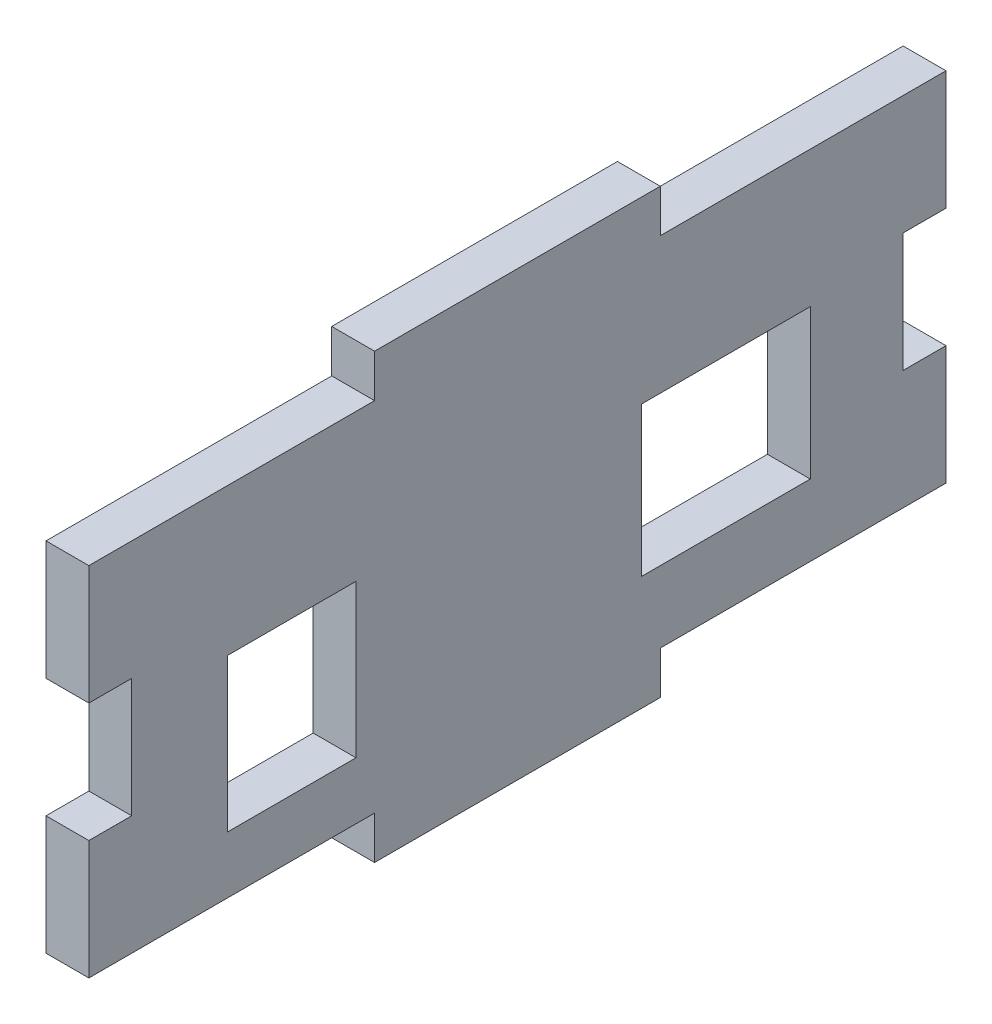
ISO-10303-21;
HEADER;
FILE_DESCRIPTION(('STEP AP214'),'2;1');
FILE_NAME('part.step','',(''),(''),'','','');
FILE_SCHEMA(('AUTOMOTIVE_DESIGN { 1 0 10303 214 1 1 1 1 }'));
ENDSEC;
DATA;
#1=APPLICATION_CONTEXT('core data for automotive mechanical design processes');
#2=APPLICATION_PROTOCOL_DEFINITION('international standard','automotive_design',2000,#1);
#3=PRODUCT_CONTEXT('',#1,'mechanical');
#4=PRODUCT('Part','Part','',(#3));
#5=PRODUCT_RELATED_PRODUCT_CATEGORY('part','',(#4));
#6=PRODUCT_DEFINITION_FORMATION('','',#4);
#7=PRODUCT_DEFINITION_CONTEXT('part definition',#1,'design');
#8=PRODUCT_DEFINITION('design','',#6,#7);
#9=PRODUCT_DEFINITION_SHAPE('','',#8);
#10=(LENGTH_UNIT() NAMED_UNIT(*) SI_UNIT(.MILLI.,.METRE.));
#11=(NAMED_UNIT(*) PLANE_ANGLE_UNIT() SI_UNIT($,.RADIAN.));
#12=(NAMED_UNIT(*) SI_UNIT($,.STERADIAN.) SOLID_ANGLE_UNIT());
#13=UNCERTAINTY_MEASURE_WITH_UNIT(LENGTH_MEASURE(1.E-05),#10,'distance_accuracy_value','');
#14=(GEOMETRIC_REPRESENTATION_CONTEXT(3) GLOBAL_UNCERTAINTY_ASSIGNED_CONTEXT((#13)) GLOBAL_UNIT_ASSIGNED_CONTEXT((#10,
#11,#12)) REPRESENTATION_CONTEXT('',''));
#15=CARTESIAN_POINT('',(0.,0.,0.));
#16=DIRECTION('',(0.,0.,1.));
#17=DIRECTION('',(1.,0.,0.));
#18=AXIS2_PLACEMENT_3D('',#15,#16,#17);
#19=CARTESIAN_POINT('',(3.,0.,0.));
#20=DIRECTION('',(-1.,0.,0.));
#21=DIRECTION('',(0.,0.,1.));
#22=AXIS2_PLACEMENT_3D('',#19,#20,#21);
#23=PLANE('',#22);
#24=DIRECTION('',(0.,1.,0.));
#25=VECTOR('',#24,1.);
#26=CARTESIAN_POINT('',(3.,15.45,-50.5));
#27=LINE('',#26,#25);
#28=CARTESIAN_POINT('',(3.,5.,-50.5));
#29=VERTEX_POINT('',#28);
#30=CARTESIAN_POINT('',(3.,15.45,-50.5));
#31=VERTEX_POINT('',#30);
#32=EDGE_CURVE('E254',#29,#31,#27,.T.);
#33=ORIENTED_EDGE('',*,*,#32,.F.);
#34=DIRECTION('',(0.,0.,-1.));
#35=VECTOR('',#34,1.);
#36=CARTESIAN_POINT('',(3.,5.,-50.5));
#37=LINE('',#36,#35);
#38=CARTESIAN_POINT('',(3.,5.,-38.7));
#39=VERTEX_POINT('',#38);
#40=EDGE_CURVE('E262',#39,#29,#37,.T.);
#41=ORIENTED_EDGE('',*,*,#40,.F.);
#42=DIRECTION('',(0.,-1.,0.));
#43=VECTOR('',#42,1.);
#44=CARTESIAN_POINT('',(3.,15.45,-38.7));
#45=LINE('',#44,#43);
#46=CARTESIAN_POINT('',(3.,15.45,-38.7));
#47=VERTEX_POINT('',#46);
#48=EDGE_CURVE('E259',#47,#39,#45,.T.);
#49=ORIENTED_EDGE('',*,*,#48,.F.);
#50=DIRECTION('',(0.,0.,1.));
#51=VECTOR('',#50,1.);
#52=CARTESIAN_POINT('',(3.,15.45,-50.5));
#53=LINE('',#52,#51);
#54=EDGE_CURVE('E256',#31,#47,#53,.T.);
#55=ORIENTED_EDGE('',*,*,#54,.F.);
#56=EDGE_LOOP('',(#33,#41,#49,#55));
#57=FACE_BOUND('',#56,.T.);
#58=DIRECTION('',(0.,-1.,0.));
#59=VECTOR('',#58,1.);
#60=CARTESIAN_POINT('',(3.,0.,0.));
#61=LINE('',#60,#59);
#62=CARTESIAN_POINT('',(3.,8.33333333,0.));
#63=VERTEX_POINT('',#62);
#64=CARTESIAN_POINT('',(3.,0.,0.));
#65=VERTEX_POINT('',#64);
#66=EDGE_CURVE('E285',#63,#65,#61,.T.);
#67=ORIENTED_EDGE('',*,*,#66,.T.);
#68=DIRECTION('',(0.,0.,-1.));
#69=VECTOR('',#68,1.);
#70=CARTESIAN_POINT('',(3.,0.,0.));
#71=LINE('',#70,#69);
#72=CARTESIAN_POINT('',(3.,0.,-20.));
#73=VERTEX_POINT('',#72);
#74=EDGE_CURVE('E288',#65,#73,#71,.T.);
#75=ORIENTED_EDGE('',*,*,#74,.T.);
#76=DIRECTION('',(0.,-1.,0.));
#77=VECTOR('',#76,1.);
#78=CARTESIAN_POINT('',(3.,0.,-20.));
#79=LINE('',#78,#77);
#80=CARTESIAN_POINT('',(3.,-3.,-20.));
#81=VERTEX_POINT('',#80);
#82=EDGE_CURVE('E291',#73,#81,#79,.T.);
#83=ORIENTED_EDGE('',*,*,#82,.T.);
#84=DIRECTION('',(0.,0.,-1.));
#85=VECTOR('',#84,1.);
#86=CARTESIAN_POINT('',(3.,-3.,-20.));
#87=LINE('',#86,#85);
#88=CARTESIAN_POINT('',(3.,-3.,-40.));
#89=VERTEX_POINT('',#88);
#90=EDGE_CURVE('E293',#81,#89,#87,.T.);
#91=ORIENTED_EDGE('',*,*,#90,.T.);
#92=DIRECTION('',(0.,1.,0.));
#93=VECTOR('',#92,1.);
#94=CARTESIAN_POINT('',(3.,0.,-40.));
#95=LINE('',#94,#93);
#96=CARTESIAN_POINT('',(3.,0.,-40.));
#97=VERTEX_POINT('',#96);
#98=EDGE_CURVE('E295',#89,#97,#95,.T.);
#99=ORIENTED_EDGE('',*,*,#98,.T.);
#100=DIRECTION('',(0.,0.,-1.));
#101=VECTOR('',#100,1.);
#102=CARTESIAN_POINT('',(3.,0.,-40.));
#103=LINE('',#102,#101);
#104=CARTESIAN_POINT('',(3.,0.,-60.));
#105=VERTEX_POINT('',#104);
#106=EDGE_CURVE('E297',#97,#105,#103,.T.);
#107=ORIENTED_EDGE('',*,*,#106,.T.);
#108=DIRECTION('',(0.,1.,0.));
#109=VECTOR('',#108,1.);
#110=CARTESIAN_POINT('',(3.,0.,-60.));
#111=LINE('',#110,#109);
#112=CARTESIAN_POINT('',(3.,8.33333333,-60.));
#113=VERTEX_POINT('',#112);
#114=EDGE_CURVE('E299',#105,#113,#111,.T.);
#115=ORIENTED_EDGE('',*,*,#114,.T.);
#116=DIRECTION('',(0.,0.,1.));
#117=VECTOR('',#116,1.);
#118=CARTESIAN_POINT('',(3.,8.33333333,-60.));
#119=LINE('',#118,#117);
#120=CARTESIAN_POINT('',(3.,8.33333333,-57.));
#121=VERTEX_POINT('',#120);
#122=EDGE_CURVE('E301',#113,#121,#119,.T.);
#123=ORIENTED_EDGE('',*,*,#122,.T.);
#124=DIRECTION('',(0.,1.,0.));
#125=VECTOR('',#124,1.);
#126=CARTESIAN_POINT('',(3.,16.66666666,-57.));
#127=LINE('',#126,#125);
#128=CARTESIAN_POINT('',(3.,16.66666666,-57.));
#129=VERTEX_POINT('',#128);
#130=EDGE_CURVE('E303',#121,#129,#127,.T.);
#131=ORIENTED_EDGE('',*,*,#130,.T.);
#132=DIRECTION('',(0.,0.,-1.));
#133=VECTOR('',#132,1.);
#134=CARTESIAN_POINT('',(3.,16.66666666,-60.));
#135=LINE('',#134,#133);
#136=CARTESIAN_POINT('',(3.,16.66666666,-60.));
#137=VERTEX_POINT('',#136);
#138=EDGE_CURVE('E305',#129,#137,#135,.T.);
#139=ORIENTED_EDGE('',*,*,#138,.T.);
#140=DIRECTION('',(0.,1.,0.));
#141=VECTOR('',#140,1.);
#142=CARTESIAN_POINT('',(3.,16.66666666,-60.));
#143=LINE('',#142,#141);
#144=CARTESIAN_POINT('',(3.,25.,-60.));
#145=VERTEX_POINT('',#144);
#146=EDGE_CURVE('E307',#137,#145,#143,.T.);
#147=ORIENTED_EDGE('',*,*,#146,.T.);
#148=DIRECTION('',(0.,0.,1.));
#149=VECTOR('',#148,1.);
#150=CARTESIAN_POINT('',(3.,25.,-40.));
#151=LINE('',#150,#149);
#152=CARTESIAN_POINT('',(3.,25.,-40.));
#153=VERTEX_POINT('',#152);
#154=EDGE_CURVE('E309',#145,#153,#151,.T.);
#155=ORIENTED_EDGE('',*,*,#154,.T.);
#156=DIRECTION('',(0.,1.,0.));
#157=VECTOR('',#156,1.);
#158=CARTESIAN_POINT('',(3.,25.,-40.));
#159=LINE('',#158,#157);
#160=CARTESIAN_POINT('',(3.,28.,-40.));
#161=VERTEX_POINT('',#160);
#162=EDGE_CURVE('E311',#153,#161,#159,.T.);
#163=ORIENTED_EDGE('',*,*,#162,.T.);
#164=DIRECTION('',(0.,0.,1.));
#165=VECTOR('',#164,1.);
#166=CARTESIAN_POINT('',(3.,28.,-20.));
#167=LINE('',#166,#165);
#168=CARTESIAN_POINT('',(3.,28.,-20.));
#169=VERTEX_POINT('',#168);
#170=EDGE_CURVE('E313',#161,#169,#167,.T.);
#171=ORIENTED_EDGE('',*,*,#170,.T.);
#172=DIRECTION('',(0.,-1.,0.));
#173=VECTOR('',#172,1.);
#174=CARTESIAN_POINT('',(3.,25.,-20.));
#175=LINE('',#174,#173);
#176=CARTESIAN_POINT('',(3.,25.,-20.));
#177=VERTEX_POINT('',#176);
#178=EDGE_CURVE('E315',#169,#177,#175,.T.);
#179=ORIENTED_EDGE('',*,*,#178,.T.);
#180=DIRECTION('',(0.,0.,1.));
#181=VECTOR('',#180,1.);
#182=CARTESIAN_POINT('',(3.,25.,0.));
#183=LINE('',#182,#181);
#184=CARTESIAN_POINT('',(3.,25.,0.));
#185=VERTEX_POINT('',#184);
#186=EDGE_CURVE('E317',#177,#185,#183,.T.);
#187=ORIENTED_EDGE('',*,*,#186,.T.);
#188=DIRECTION('',(0.,-1.,0.));
#189=VECTOR('',#188,1.);
#190=CARTESIAN_POINT('',(3.,16.66666666,0.));
#191=LINE('',#190,#189);
#192=CARTESIAN_POINT('',(3.,16.66666666,0.));
#193=VERTEX_POINT('',#192);
#194=EDGE_CURVE('E319',#185,#193,#191,.T.);
#195=ORIENTED_EDGE('',*,*,#194,.T.);
#196=DIRECTION('',(0.,0.,-1.));
#197=VECTOR('',#196,1.);
#198=CARTESIAN_POINT('',(3.,16.66666666,0.));
#199=LINE('',#198,#197);
#200=CARTESIAN_POINT('',(3.,16.66666666,-2.99999999999999));
#201=VERTEX_POINT('',#200);
#202=EDGE_CURVE('E321',#193,#201,#199,.T.);
#203=ORIENTED_EDGE('',*,*,#202,.T.);
#204=DIRECTION('',(0.,-1.,0.));
#205=VECTOR('',#204,1.);
#206=CARTESIAN_POINT('',(3.,16.66666666,-2.99999999999999));
#207=LINE('',#206,#205);
#208=CARTESIAN_POINT('',(3.,8.33333333,-3.));
#209=VERTEX_POINT('',#208);
#210=EDGE_CURVE('E323',#201,#209,#207,.T.);
#211=ORIENTED_EDGE('',*,*,#210,.T.);
#212=DIRECTION('',(0.,0.,1.));
#213=VECTOR('',#212,1.);
#214=CARTESIAN_POINT('',(3.,8.33333333,0.));
#215=LINE('',#214,#213);
#216=EDGE_CURVE('E325',#209,#63,#215,.T.);
#217=ORIENTED_EDGE('',*,*,#216,.T.);
#218=EDGE_LOOP('',(#67,#75,#83,#91,#99,#107,#115,#123,#131,#139,#147,#155,#163,#171,#179,#187,
#195,#203,#211,#217));
#219=FACE_BOUND('',#218,.T.);
#220=DIRECTION('',(0.,1.,0.));
#221=VECTOR('',#220,1.);
#222=CARTESIAN_POINT('',(3.,14.7,-18.7));
#223=LINE('',#222,#221);
#224=CARTESIAN_POINT('',(3.,4.,-18.7));
#225=VERTEX_POINT('',#224);
#226=CARTESIAN_POINT('',(3.,14.7,-18.7));
#227=VERTEX_POINT('',#226);
#228=EDGE_CURVE('E218',#225,#227,#223,.T.);
#229=ORIENTED_EDGE('',*,*,#228,.F.);
#230=DIRECTION('',(0.,0.,-1.));
#231=VECTOR('',#230,1.);
#232=CARTESIAN_POINT('',(3.,4.,-18.7));
#233=LINE('',#232,#231);
#234=CARTESIAN_POINT('',(3.,4.,-9.7));
#235=VERTEX_POINT('',#234);
#236=EDGE_CURVE('E240',#235,#225,#233,.T.);
#237=ORIENTED_EDGE('',*,*,#236,.F.);
#238=DIRECTION('',(0.,-1.,0.));
#239=VECTOR('',#238,1.);
#240=CARTESIAN_POINT('',(3.,14.7,-9.7));
#241=LINE('',#240,#239);
#242=CARTESIAN_POINT('',(3.,14.7,-9.7));
#243=VERTEX_POINT('',#242);
#244=EDGE_CURVE('E238',#243,#235,#241,.T.);
#245=ORIENTED_EDGE('',*,*,#244,.F.);
#246=DIRECTION('',(0.,0.,1.));
#247=VECTOR('',#246,1.);
#248=CARTESIAN_POINT('',(3.,14.7,-18.7));
#249=LINE('',#248,#247);
#250=EDGE_CURVE('E226',#227,#243,#249,.T.);
#251=ORIENTED_EDGE('',*,*,#250,.F.);
#252=EDGE_LOOP('',(#229,#237,#245,#251));
#253=FACE_BOUND('',#252,.T.);
#254=ADVANCED_FACE('F33',(#57,#219,#253),#23,.F.);
#255=CARTESIAN_POINT('',(0.,0.,0.));
#256=DIRECTION('',(-1.,0.,0.));
#257=DIRECTION('',(0.,0.,1.));
#258=AXIS2_PLACEMENT_3D('',#255,#256,#257);
#259=PLANE('',#258);
#260=DIRECTION('',(0.,-1.,0.));
#261=VECTOR('',#260,1.);
#262=CARTESIAN_POINT('',(0.,0.,0.));
#263=LINE('',#262,#261);
#264=CARTESIAN_POINT('',(0.,8.33333333,0.));
#265=VERTEX_POINT('',#264);
#266=CARTESIAN_POINT('',(0.,0.,0.));
#267=VERTEX_POINT('',#266);
#268=EDGE_CURVE('E284',#265,#267,#263,.T.);
#269=ORIENTED_EDGE('',*,*,#268,.F.);
#270=DIRECTION('',(0.,0.,1.));
#271=VECTOR('',#270,1.);
#272=CARTESIAN_POINT('',(0.,8.33333333,0.));
#273=LINE('',#272,#271);
#274=CARTESIAN_POINT('',(0.,8.33333333,-3.));
#275=VERTEX_POINT('',#274);
#276=EDGE_CURVE('E289',#275,#265,#273,.T.);
#277=ORIENTED_EDGE('',*,*,#276,.F.);
#278=DIRECTION('',(0.,-1.,0.));
#279=VECTOR('',#278,1.);
#280=CARTESIAN_POINT('',(0.,16.66666666,-2.99999999999999));
#281=LINE('',#280,#279);
#282=CARTESIAN_POINT('',(0.,16.66666666,-2.99999999999999));
#283=VERTEX_POINT('',#282);
#284=EDGE_CURVE('E364',#283,#275,#281,.T.);
#285=ORIENTED_EDGE('',*,*,#284,.F.);
#286=DIRECTION('',(0.,0.,-1.));
#287=VECTOR('',#286,1.);
#288=CARTESIAN_POINT('',(0.,16.66666666,0.));
#289=LINE('',#288,#287);
#290=CARTESIAN_POINT('',(0.,16.66666666,0.));
#291=VERTEX_POINT('',#290);
#292=EDGE_CURVE('E362',#291,#283,#289,.T.);
#293=ORIENTED_EDGE('',*,*,#292,.F.);
#294=DIRECTION('',(0.,-1.,0.));
#295=VECTOR('',#294,1.);
#296=CARTESIAN_POINT('',(0.,16.66666666,0.));
#297=LINE('',#296,#295);
#298=CARTESIAN_POINT('',(0.,25.,0.));
#299=VERTEX_POINT('',#298);
#300=EDGE_CURVE('E360',#299,#291,#297,.T.);
#301=ORIENTED_EDGE('',*,*,#300,.F.);
#302=DIRECTION('',(0.,0.,1.));
#303=VECTOR('',#302,1.);
#304=CARTESIAN_POINT('',(0.,25.,0.));
#305=LINE('',#304,#303);
#306=CARTESIAN_POINT('',(0.,25.,-20.));
#307=VERTEX_POINT('',#306);
#308=EDGE_CURVE('E358',#307,#299,#305,.T.);
#309=ORIENTED_EDGE('',*,*,#308,.F.);
#310=DIRECTION('',(0.,-1.,0.));
#311=VECTOR('',#310,1.);
#312=CARTESIAN_POINT('',(0.,25.,-20.));
#313=LINE('',#312,#311);
#314=CARTESIAN_POINT('',(0.,28.,-20.));
#315=VERTEX_POINT('',#314);
#316=EDGE_CURVE('E356',#315,#307,#313,.T.);
#317=ORIENTED_EDGE('',*,*,#316,.F.);
#318=DIRECTION('',(0.,0.,1.));
#319=VECTOR('',#318,1.);
#320=CARTESIAN_POINT('',(0.,28.,-20.));
#321=LINE('',#320,#319);
#322=CARTESIAN_POINT('',(0.,28.,-40.));
#323=VERTEX_POINT('',#322);
#324=EDGE_CURVE('E354',#323,#315,#321,.T.);
#325=ORIENTED_EDGE('',*,*,#324,.F.);
#326=DIRECTION('',(0.,1.,0.));
#327=VECTOR('',#326,1.);
#328=CARTESIAN_POINT('',(0.,25.,-40.));
#329=LINE('',#328,#327);
#330=CARTESIAN_POINT('',(0.,25.,-40.));
#331=VERTEX_POINT('',#330);
#332=EDGE_CURVE('E352',#331,#323,#329,.T.);
#333=ORIENTED_EDGE('',*,*,#332,.F.);
#334=DIRECTION('',(0.,0.,1.));
#335=VECTOR('',#334,1.);
#336=CARTESIAN_POINT('',(0.,25.,-40.));
#337=LINE('',#336,#335);
#338=CARTESIAN_POINT('',(0.,25.,-60.));
#339=VERTEX_POINT('',#338);
#340=EDGE_CURVE('E350',#339,#331,#337,.T.);
#341=ORIENTED_EDGE('',*,*,#340,.F.);
#342=DIRECTION('',(0.,1.,0.));
#343=VECTOR('',#342,1.);
#344=CARTESIAN_POINT('',(0.,16.66666666,-60.));
#345=LINE('',#344,#343);
#346=CARTESIAN_POINT('',(0.,16.66666666,-60.));
#347=VERTEX_POINT('',#346);
#348=EDGE_CURVE('E348',#347,#339,#345,.T.);
#349=ORIENTED_EDGE('',*,*,#348,.F.);
#350=DIRECTION('',(0.,0.,-1.));
#351=VECTOR('',#350,1.);
#352=CARTESIAN_POINT('',(0.,16.66666666,-60.));
#353=LINE('',#352,#351);
#354=CARTESIAN_POINT('',(0.,16.66666666,-57.));
#355=VERTEX_POINT('',#354);
#356=EDGE_CURVE('E346',#355,#347,#353,.T.);
#357=ORIENTED_EDGE('',*,*,#356,.F.);
#358=DIRECTION('',(0.,1.,0.));
#359=VECTOR('',#358,1.);
#360=CARTESIAN_POINT('',(0.,16.66666666,-57.));
#361=LINE('',#360,#359);
#362=CARTESIAN_POINT('',(0.,8.33333333,-57.));
#363=VERTEX_POINT('',#362);
#364=EDGE_CURVE('E344',#363,#355,#361,.T.);
#365=ORIENTED_EDGE('',*,*,#364,.F.);
#366=DIRECTION('',(0.,0.,1.));
#367=VECTOR('',#366,1.);
#368=CARTESIAN_POINT('',(0.,8.33333333,-60.));
#369=LINE('',#368,#367);
#370=CARTESIAN_POINT('',(0.,8.33333333,-60.));
#371=VERTEX_POINT('',#370);
#372=EDGE_CURVE('E342',#371,#363,#369,.T.);
#373=ORIENTED_EDGE('',*,*,#372,.F.);
#374=DIRECTION('',(0.,1.,0.));
#375=VECTOR('',#374,1.);
#376=CARTESIAN_POINT('',(0.,0.,-60.));
#377=LINE('',#376,#375);
#378=CARTESIAN_POINT('',(0.,0.,-60.));
#379=VERTEX_POINT('',#378);
#380=EDGE_CURVE('E340',#379,#371,#377,.T.);
#381=ORIENTED_EDGE('',*,*,#380,.F.);
#382=DIRECTION('',(0.,0.,-1.));
#383=VECTOR('',#382,1.);
#384=CARTESIAN_POINT('',(0.,0.,-40.));
#385=LINE('',#384,#383);
#386=CARTESIAN_POINT('',(0.,0.,-40.));
#387=VERTEX_POINT('',#386);
#388=EDGE_CURVE('E338',#387,#379,#385,.T.);
#389=ORIENTED_EDGE('',*,*,#388,.F.);
#390=DIRECTION('',(0.,1.,0.));
#391=VECTOR('',#390,1.);
#392=CARTESIAN_POINT('',(0.,0.,-40.));
#393=LINE('',#392,#391);
#394=CARTESIAN_POINT('',(0.,-3.,-40.));
#395=VERTEX_POINT('',#394);
#396=EDGE_CURVE('E336',#395,#387,#393,.T.);
#397=ORIENTED_EDGE('',*,*,#396,.F.);
#398=DIRECTION('',(0.,0.,-1.));
#399=VECTOR('',#398,1.);
#400=CARTESIAN_POINT('',(0.,-3.,-20.));
#401=LINE('',#400,#399);
#402=CARTESIAN_POINT('',(0.,-3.,-20.));
#403=VERTEX_POINT('',#402);
#404=EDGE_CURVE('E334',#403,#395,#401,.T.);
#405=ORIENTED_EDGE('',*,*,#404,.F.);
#406=DIRECTION('',(0.,-1.,0.));
#407=VECTOR('',#406,1.);
#408=CARTESIAN_POINT('',(0.,0.,-20.));
#409=LINE('',#408,#407);
#410=CARTESIAN_POINT('',(0.,0.,-20.));
#411=VERTEX_POINT('',#410);
#412=EDGE_CURVE('E332',#411,#403,#409,.T.);
#413=ORIENTED_EDGE('',*,*,#412,.F.);
#414=DIRECTION('',(0.,0.,-1.));
#415=VECTOR('',#414,1.);
#416=CARTESIAN_POINT('',(0.,0.,0.));
#417=LINE('',#416,#415);
#418=EDGE_CURVE('E330',#267,#411,#417,.T.);
#419=ORIENTED_EDGE('',*,*,#418,.F.);
#420=EDGE_LOOP('',(#269,#277,#285,#293,#301,#309,#317,#325,#333,#341,#349,#357,#365,#373,#381,
#389,#397,#405,#413,#419));
#421=FACE_BOUND('',#420,.T.);
#422=DIRECTION('',(0.,0.,-1.));
#423=VECTOR('',#422,1.);
#424=CARTESIAN_POINT('',(0.,5.,-50.5));
#425=LINE('',#424,#423);
#426=CARTESIAN_POINT('',(0.,5.,-38.7));
#427=VERTEX_POINT('',#426);
#428=CARTESIAN_POINT('',(0.,5.,-50.5));
#429=VERTEX_POINT('',#428);
#430=EDGE_CURVE('E257',#427,#429,#425,.T.);
#431=ORIENTED_EDGE('',*,*,#430,.T.);
#432=DIRECTION('',(0.,1.,0.));
#433=VECTOR('',#432,1.);
#434=CARTESIAN_POINT('',(0.,15.45,-50.5));
#435=LINE('',#434,#433);
#436=CARTESIAN_POINT('',(0.,15.45,-50.5));
#437=VERTEX_POINT('',#436);
#438=EDGE_CURVE('E234',#429,#437,#435,.T.);
#439=ORIENTED_EDGE('',*,*,#438,.T.);
#440=DIRECTION('',(0.,0.,1.));
#441=VECTOR('',#440,1.);
#442=CARTESIAN_POINT('',(0.,15.45,-50.5));
#443=LINE('',#442,#441);
#444=CARTESIAN_POINT('',(0.,15.45,-38.7));
#445=VERTEX_POINT('',#444);
#446=EDGE_CURVE('E267',#437,#445,#443,.T.);
#447=ORIENTED_EDGE('',*,*,#446,.T.);
#448=DIRECTION('',(0.,-1.,0.));
#449=VECTOR('',#448,1.);
#450=CARTESIAN_POINT('',(0.,15.45,-38.7));
#451=LINE('',#450,#449);
#452=EDGE_CURVE('E270',#445,#427,#451,.T.);
#453=ORIENTED_EDGE('',*,*,#452,.T.);
#454=EDGE_LOOP('',(#431,#439,#447,#453));
#455=FACE_BOUND('',#454,.T.);
#456=DIRECTION('',(0.,0.,-1.));
#457=VECTOR('',#456,1.);
#458=CARTESIAN_POINT('',(0.,4.,-18.7));
#459=LINE('',#458,#457);
#460=CARTESIAN_POINT('',(0.,4.,-9.7));
#461=VERTEX_POINT('',#460);
#462=CARTESIAN_POINT('',(0.,4.,-18.7));
#463=VERTEX_POINT('',#462);
#464=EDGE_CURVE('E227',#461,#463,#459,.T.);
#465=ORIENTED_EDGE('',*,*,#464,.T.);
#466=DIRECTION('',(0.,1.,0.));
#467=VECTOR('',#466,1.);
#468=CARTESIAN_POINT('',(0.,14.7,-18.7));
#469=LINE('',#468,#467);
#470=CARTESIAN_POINT('',(0.,14.7,-18.7));
#471=VERTEX_POINT('',#470);
#472=EDGE_CURVE('E56',#463,#471,#469,.T.);
#473=ORIENTED_EDGE('',*,*,#472,.T.);
#474=DIRECTION('',(0.,0.,1.));
#475=VECTOR('',#474,1.);
#476=CARTESIAN_POINT('',(0.,14.7,-18.7));
#477=LINE('',#476,#475);
#478=CARTESIAN_POINT('',(0.,14.7,-9.7));
#479=VERTEX_POINT('',#478);
#480=EDGE_CURVE('E233',#471,#479,#477,.T.);
#481=ORIENTED_EDGE('',*,*,#480,.T.);
#482=DIRECTION('',(0.,-1.,0.));
#483=VECTOR('',#482,1.);
#484=CARTESIAN_POINT('',(0.,14.7,-9.7));
#485=LINE('',#484,#483);
#486=EDGE_CURVE('E246',#479,#461,#485,.T.);
#487=ORIENTED_EDGE('',*,*,#486,.T.);
#488=EDGE_LOOP('',(#465,#473,#481,#487));
#489=FACE_BOUND('',#488,.T.);
#490=ADVANCED_FACE('F430',(#421,#455,#489),#259,.T.);
#491=CARTESIAN_POINT('',(3.,0.,0.));
#492=DIRECTION('',(0.,0.,-1.));
#493=DIRECTION('',(0.,1.,0.));
#494=AXIS2_PLACEMENT_3D('',#491,#492,#493);
#495=PLANE('',#494);
#496=ORIENTED_EDGE('',*,*,#268,.T.);
#497=DIRECTION('',(-1.,0.,0.));
#498=VECTOR('',#497,1.);
#499=CARTESIAN_POINT('',(3.,0.,0.));
#500=LINE('',#499,#498);
#501=EDGE_CURVE('E11',#65,#267,#500,.T.);
#502=ORIENTED_EDGE('',*,*,#501,.F.);
#503=ORIENTED_EDGE('',*,*,#66,.F.);
#504=DIRECTION('',(-1.,0.,0.));
#505=VECTOR('',#504,1.);
#506=CARTESIAN_POINT('',(3.,8.33333333,0.));
#507=LINE('',#506,#505);
#508=EDGE_CURVE('E327',#63,#265,#507,.T.);
#509=ORIENTED_EDGE('',*,*,#508,.T.);
#510=EDGE_LOOP('',(#496,#502,#503,#509));
#511=FACE_BOUND('',#510,.T.);
#512=ADVANCED_FACE('F35',(#511),#495,.F.);
#513=CARTESIAN_POINT('',(3.,0.,0.));
#514=DIRECTION('',(0.,1.,0.));
#515=DIRECTION('',(0.,0.,1.));
#516=AXIS2_PLACEMENT_3D('',#513,#514,#515);
#517=PLANE('',#516);
#518=ORIENTED_EDGE('',*,*,#418,.T.);
#519=DIRECTION('',(-1.,0.,0.));
#520=VECTOR('',#519,1.);
#521=CARTESIAN_POINT('',(3.,0.,-20.));
#522=LINE('',#521,#520);
#523=EDGE_CURVE('E41',#73,#411,#522,.T.);
#524=ORIENTED_EDGE('',*,*,#523,.F.);
#525=ORIENTED_EDGE('',*,*,#74,.F.);
#526=ORIENTED_EDGE('',*,*,#501,.T.);
#527=EDGE_LOOP('',(#518,#524,#525,#526));
#528=FACE_BOUND('',#527,.T.);
#529=ADVANCED_FACE('F447',(#528),#517,.F.);
#530=CARTESIAN_POINT('',(3.,0.,-20.));
#531=DIRECTION('',(0.,0.,-1.));
#532=DIRECTION('',(-1.,0.,0.));
#533=AXIS2_PLACEMENT_3D('',#530,#531,#532);
#534=PLANE('',#533);
#535=ORIENTED_EDGE('',*,*,#412,.T.);
#536=DIRECTION('',(-1.,0.,0.));
#537=VECTOR('',#536,1.);
#538=CARTESIAN_POINT('',(3.,-3.,-20.));
#539=LINE('',#538,#537);
#540=EDGE_CURVE('E417',#81,#403,#539,.T.);
#541=ORIENTED_EDGE('',*,*,#540,.F.);
#542=ORIENTED_EDGE('',*,*,#82,.F.);
#543=ORIENTED_EDGE('',*,*,#523,.T.);
#544=EDGE_LOOP('',(#535,#541,#542,#543));
#545=FACE_BOUND('',#544,.T.);
#546=ADVANCED_FACE('F424',(#545),#534,.F.);
#547=CARTESIAN_POINT('',(3.,-3.,-20.));
#548=DIRECTION('',(0.,1.,0.));
#549=DIRECTION('',(0.,0.,1.));
#550=AXIS2_PLACEMENT_3D('',#547,#548,#549);
#551=PLANE('',#550);
#552=ORIENTED_EDGE('',*,*,#404,.T.);
#553=DIRECTION('',(-1.,0.,0.));
#554=VECTOR('',#553,1.);
#555=CARTESIAN_POINT('',(3.,-3.,-40.));
#556=LINE('',#555,#554);
#557=EDGE_CURVE('E414',#89,#395,#556,.T.);
#558=ORIENTED_EDGE('',*,*,#557,.F.);
#559=ORIENTED_EDGE('',*,*,#90,.F.);
#560=ORIENTED_EDGE('',*,*,#540,.T.);
#561=EDGE_LOOP('',(#552,#558,#559,#560));
#562=FACE_BOUND('',#561,.T.);
#563=ADVANCED_FACE('F436',(#562),#551,.F.);
#564=CARTESIAN_POINT('',(3.,0.,-40.));
#565=DIRECTION('',(0.,0.,1.));
#566=DIRECTION('',(1.,0.,0.));
#567=AXIS2_PLACEMENT_3D('',#564,#565,#566);
#568=PLANE('',#567);
#569=ORIENTED_EDGE('',*,*,#396,.T.);
#570=DIRECTION('',(-1.,0.,0.));
#571=VECTOR('',#570,1.);
#572=CARTESIAN_POINT('',(3.,0.,-40.));
#573=LINE('',#572,#571);
#574=EDGE_CURVE('E411',#97,#387,#573,.T.);
#575=ORIENTED_EDGE('',*,*,#574,.F.);
#576=ORIENTED_EDGE('',*,*,#98,.F.);
#577=ORIENTED_EDGE('',*,*,#557,.T.);
#578=EDGE_LOOP('',(#569,#575,#576,#577));
#579=FACE_BOUND('',#578,.T.);
#580=ADVANCED_FACE('F440',(#579),#568,.F.);
#581=CARTESIAN_POINT('',(3.,0.,-40.));
#582=DIRECTION('',(0.,1.,0.));
#583=DIRECTION('',(0.,0.,1.));
#584=AXIS2_PLACEMENT_3D('',#581,#582,#583);
#585=PLANE('',#584);
#586=ORIENTED_EDGE('',*,*,#388,.T.);
#587=DIRECTION('',(-1.,0.,0.));
#588=VECTOR('',#587,1.);
#589=CARTESIAN_POINT('',(3.,0.,-60.));
#590=LINE('',#589,#588);
#591=EDGE_CURVE('E408',#105,#379,#590,.T.);
#592=ORIENTED_EDGE('',*,*,#591,.F.);
#593=ORIENTED_EDGE('',*,*,#106,.F.);
#594=ORIENTED_EDGE('',*,*,#574,.T.);
#595=EDGE_LOOP('',(#586,#592,#593,#594));
#596=FACE_BOUND('',#595,.T.);
#597=ADVANCED_FACE('F520',(#596),#585,.F.);
#598=CARTESIAN_POINT('',(3.,0.,-60.));
#599=DIRECTION('',(0.,0.,1.));
#600=DIRECTION('',(1.,0.,0.));
#601=AXIS2_PLACEMENT_3D('',#598,#599,#600);
#602=PLANE('',#601);
#603=ORIENTED_EDGE('',*,*,#380,.T.);
#604=DIRECTION('',(-1.,0.,0.));
#605=VECTOR('',#604,1.);
#606=CARTESIAN_POINT('',(3.,8.33333333,-60.));
#607=LINE('',#606,#605);
#608=EDGE_CURVE('E405',#113,#371,#607,.T.);
#609=ORIENTED_EDGE('',*,*,#608,.F.);
#610=ORIENTED_EDGE('',*,*,#114,.F.);
#611=ORIENTED_EDGE('',*,*,#591,.T.);
#612=EDGE_LOOP('',(#603,#609,#610,#611));
#613=FACE_BOUND('',#612,.T.);
#614=ADVANCED_FACE('F518',(#613),#602,.F.);
#615=CARTESIAN_POINT('',(3.,8.33333333,-60.));
#616=DIRECTION('',(0.,-1.,0.));
#617=DIRECTION('',(0.,0.,-1.));
#618=AXIS2_PLACEMENT_3D('',#615,#616,#617);
#619=PLANE('',#618);
#620=ORIENTED_EDGE('',*,*,#372,.T.);
#621=DIRECTION('',(-1.,0.,0.));
#622=VECTOR('',#621,1.);
#623=CARTESIAN_POINT('',(3.,8.33333333,-57.));
#624=LINE('',#623,#622);
#625=EDGE_CURVE('E402',#121,#363,#624,.T.);
#626=ORIENTED_EDGE('',*,*,#625,.F.);
#627=ORIENTED_EDGE('',*,*,#122,.F.);
#628=ORIENTED_EDGE('',*,*,#608,.T.);
#629=EDGE_LOOP('',(#620,#626,#627,#628));
#630=FACE_BOUND('',#629,.T.);
#631=ADVANCED_FACE('F513',(#630),#619,.F.);
#632=CARTESIAN_POINT('',(3.,16.66666666,-57.));
#633=DIRECTION('',(0.,0.,1.));
#634=DIRECTION('',(1.,0.,0.));
#635=AXIS2_PLACEMENT_3D('',#632,#633,#634);
#636=PLANE('',#635);
#637=ORIENTED_EDGE('',*,*,#364,.T.);
#638=DIRECTION('',(-1.,0.,0.));
#639=VECTOR('',#638,1.);
#640=CARTESIAN_POINT('',(3.,16.66666666,-57.));
#641=LINE('',#640,#639);
#642=EDGE_CURVE('E399',#129,#355,#641,.T.);
#643=ORIENTED_EDGE('',*,*,#642,.F.);
#644=ORIENTED_EDGE('',*,*,#130,.F.);
#645=ORIENTED_EDGE('',*,*,#625,.T.);
#646=EDGE_LOOP('',(#637,#643,#644,#645));
#647=FACE_BOUND('',#646,.T.);
#648=ADVANCED_FACE('F508',(#647),#636,.F.);
#649=CARTESIAN_POINT('',(3.,16.66666666,-60.));
#650=DIRECTION('',(0.,1.,0.));
#651=DIRECTION('',(0.,0.,1.));
#652=AXIS2_PLACEMENT_3D('',#649,#650,#651);
#653=PLANE('',#652);
#654=ORIENTED_EDGE('',*,*,#356,.T.);
#655=DIRECTION('',(-1.,0.,0.));
#656=VECTOR('',#655,1.);
#657=CARTESIAN_POINT('',(3.,16.66666666,-60.));
#658=LINE('',#657,#656);
#659=EDGE_CURVE('E396',#137,#347,#658,.T.);
#660=ORIENTED_EDGE('',*,*,#659,.F.);
#661=ORIENTED_EDGE('',*,*,#138,.F.);
#662=ORIENTED_EDGE('',*,*,#642,.T.);
#663=EDGE_LOOP('',(#654,#660,#661,#662));
#664=FACE_BOUND('',#663,.T.);
#665=ADVANCED_FACE('F504',(#664),#653,.F.);
#666=CARTESIAN_POINT('',(3.,16.66666666,-60.));
#667=DIRECTION('',(0.,0.,1.));
#668=DIRECTION('',(1.,0.,0.));
#669=AXIS2_PLACEMENT_3D('',#666,#667,#668);
#670=PLANE('',#669);
#671=ORIENTED_EDGE('',*,*,#348,.T.);
#672=DIRECTION('',(-1.,0.,0.));
#673=VECTOR('',#672,1.);
#674=CARTESIAN_POINT('',(3.,25.,-60.));
#675=LINE('',#674,#673);
#676=EDGE_CURVE('E393',#145,#339,#675,.T.);
#677=ORIENTED_EDGE('',*,*,#676,.F.);
#678=ORIENTED_EDGE('',*,*,#146,.F.);
#679=ORIENTED_EDGE('',*,*,#659,.T.);
#680=EDGE_LOOP('',(#671,#677,#678,#679));
#681=FACE_BOUND('',#680,.T.);
#682=ADVANCED_FACE('F499',(#681),#670,.F.);
#683=CARTESIAN_POINT('',(3.,25.,-40.));
#684=DIRECTION('',(0.,-1.,0.));
#685=DIRECTION('',(0.,0.,-1.));
#686=AXIS2_PLACEMENT_3D('',#683,#684,#685);
#687=PLANE('',#686);
#688=ORIENTED_EDGE('',*,*,#340,.T.);
#689=DIRECTION('',(-1.,0.,0.));
#690=VECTOR('',#689,1.);
#691=CARTESIAN_POINT('',(3.,25.,-40.));
#692=LINE('',#691,#690);
#693=EDGE_CURVE('E390',#153,#331,#692,.T.);
#694=ORIENTED_EDGE('',*,*,#693,.F.);
#695=ORIENTED_EDGE('',*,*,#154,.F.);
#696=ORIENTED_EDGE('',*,*,#676,.T.);
#697=EDGE_LOOP('',(#688,#694,#695,#696));
#698=FACE_BOUND('',#697,.T.);
#699=ADVANCED_FACE('F493',(#698),#687,.F.);
#700=CARTESIAN_POINT('',(3.,25.,-40.));
#701=DIRECTION('',(0.,0.,1.));
#702=DIRECTION('',(1.,0.,0.));
#703=AXIS2_PLACEMENT_3D('',#700,#701,#702);
#704=PLANE('',#703);
#705=ORIENTED_EDGE('',*,*,#332,.T.);
#706=DIRECTION('',(-1.,0.,0.));
#707=VECTOR('',#706,1.);
#708=CARTESIAN_POINT('',(3.,28.,-40.));
#709=LINE('',#708,#707);
#710=EDGE_CURVE('E387',#161,#323,#709,.T.);
#711=ORIENTED_EDGE('',*,*,#710,.F.);
#712=ORIENTED_EDGE('',*,*,#162,.F.);
#713=ORIENTED_EDGE('',*,*,#693,.T.);
#714=EDGE_LOOP('',(#705,#711,#712,#713));
#715=FACE_BOUND('',#714,.T.);
#716=ADVANCED_FACE('F489',(#715),#704,.F.);
#717=CARTESIAN_POINT('',(3.,28.,-20.));
#718=DIRECTION('',(0.,-1.,0.));
#719=DIRECTION('',(0.,0.,-1.));
#720=AXIS2_PLACEMENT_3D('',#717,#718,#719);
#721=PLANE('',#720);
#722=ORIENTED_EDGE('',*,*,#324,.T.);
#723=DIRECTION('',(-1.,0.,0.));
#724=VECTOR('',#723,1.);
#725=CARTESIAN_POINT('',(3.,28.,-20.));
#726=LINE('',#725,#724);
#727=EDGE_CURVE('E384',#169,#315,#726,.T.);
#728=ORIENTED_EDGE('',*,*,#727,.F.);
#729=ORIENTED_EDGE('',*,*,#170,.F.);
#730=ORIENTED_EDGE('',*,*,#710,.T.);
#731=EDGE_LOOP('',(#722,#728,#729,#730));
#732=FACE_BOUND('',#731,.T.);
#733=ADVANCED_FACE('F484',(#732),#721,.F.);
#734=CARTESIAN_POINT('',(3.,25.,-20.));
#735=DIRECTION('',(0.,0.,-1.));
#736=DIRECTION('',(-1.,0.,0.));
#737=AXIS2_PLACEMENT_3D('',#734,#735,#736);
#738=PLANE('',#737);
#739=ORIENTED_EDGE('',*,*,#316,.T.);
#740=DIRECTION('',(-1.,0.,0.));
#741=VECTOR('',#740,1.);
#742=CARTESIAN_POINT('',(3.,25.,-20.));
#743=LINE('',#742,#741);
#744=EDGE_CURVE('E381',#177,#307,#743,.T.);
#745=ORIENTED_EDGE('',*,*,#744,.F.);
#746=ORIENTED_EDGE('',*,*,#178,.F.);
#747=ORIENTED_EDGE('',*,*,#727,.T.);
#748=EDGE_LOOP('',(#739,#745,#746,#747));
#749=FACE_BOUND('',#748,.T.);
#750=ADVANCED_FACE('F478',(#749),#738,.F.);
#751=CARTESIAN_POINT('',(3.,25.,0.));
#752=DIRECTION('',(0.,-1.,0.));
#753=DIRECTION('',(0.,0.,-1.));
#754=AXIS2_PLACEMENT_3D('',#751,#752,#753);
#755=PLANE('',#754);
#756=ORIENTED_EDGE('',*,*,#308,.T.);
#757=DIRECTION('',(-1.,0.,0.));
#758=VECTOR('',#757,1.);
#759=CARTESIAN_POINT('',(3.,25.,0.));
#760=LINE('',#759,#758);
#761=EDGE_CURVE('E378',#185,#299,#760,.T.);
#762=ORIENTED_EDGE('',*,*,#761,.F.);
#763=ORIENTED_EDGE('',*,*,#186,.F.);
#764=ORIENTED_EDGE('',*,*,#744,.T.);
#765=EDGE_LOOP('',(#756,#762,#763,#764));
#766=FACE_BOUND('',#765,.T.);
#767=ADVANCED_FACE('F474',(#766),#755,.F.);
#768=CARTESIAN_POINT('',(3.,16.66666666,0.));
#769=DIRECTION('',(0.,0.,-1.));
#770=DIRECTION('',(0.,1.,0.));
#771=AXIS2_PLACEMENT_3D('',#768,#769,#770);
#772=PLANE('',#771);
#773=ORIENTED_EDGE('',*,*,#300,.T.);
#774=DIRECTION('',(-1.,0.,0.));
#775=VECTOR('',#774,1.);
#776=CARTESIAN_POINT('',(3.,16.66666666,0.));
#777=LINE('',#776,#775);
#778=EDGE_CURVE('E375',#193,#291,#777,.T.);
#779=ORIENTED_EDGE('',*,*,#778,.F.);
#780=ORIENTED_EDGE('',*,*,#194,.F.);
#781=ORIENTED_EDGE('',*,*,#761,.T.);
#782=EDGE_LOOP('',(#773,#779,#780,#781));
#783=FACE_BOUND('',#782,.T.);
#784=ADVANCED_FACE('F469',(#783),#772,.F.);
#785=CARTESIAN_POINT('',(3.,16.66666666,0.));
#786=DIRECTION('',(0.,1.,0.));
#787=DIRECTION('',(0.,0.,1.));
#788=AXIS2_PLACEMENT_3D('',#785,#786,#787);
#789=PLANE('',#788);
#790=ORIENTED_EDGE('',*,*,#292,.T.);
#791=DIRECTION('',(-1.,0.,0.));
#792=VECTOR('',#791,1.);
#793=CARTESIAN_POINT('',(3.,16.66666666,-2.99999999999999));
#794=LINE('',#793,#792);
#795=EDGE_CURVE('E372',#201,#283,#794,.T.);
#796=ORIENTED_EDGE('',*,*,#795,.F.);
#797=ORIENTED_EDGE('',*,*,#202,.F.);
#798=ORIENTED_EDGE('',*,*,#778,.T.);
#799=EDGE_LOOP('',(#790,#796,#797,#798));
#800=FACE_BOUND('',#799,.T.);
#801=ADVANCED_FACE('F463',(#800),#789,.F.);
#802=CARTESIAN_POINT('',(3.,16.66666666,-2.99999999999999));
#803=DIRECTION('',(0.,0.,-1.));
#804=DIRECTION('',(0.,1.,0.));
#805=AXIS2_PLACEMENT_3D('',#802,#803,#804);
#806=PLANE('',#805);
#807=ORIENTED_EDGE('',*,*,#284,.T.);
#808=DIRECTION('',(-1.,0.,0.));
#809=VECTOR('',#808,1.);
#810=CARTESIAN_POINT('',(3.,8.33333333,-3.));
#811=LINE('',#810,#809);
#812=EDGE_CURVE('E369',#209,#275,#811,.T.);
#813=ORIENTED_EDGE('',*,*,#812,.F.);
#814=ORIENTED_EDGE('',*,*,#210,.F.);
#815=ORIENTED_EDGE('',*,*,#795,.T.);
#816=EDGE_LOOP('',(#807,#813,#814,#815));
#817=FACE_BOUND('',#816,.T.);
#818=ADVANCED_FACE('F459',(#817),#806,.F.);
#819=CARTESIAN_POINT('',(3.,8.33333333,0.));
#820=DIRECTION('',(0.,-1.,0.));
#821=DIRECTION('',(0.,0.,-1.));
#822=AXIS2_PLACEMENT_3D('',#819,#820,#821);
#823=PLANE('',#822);
#824=ORIENTED_EDGE('',*,*,#276,.T.);
#825=ORIENTED_EDGE('',*,*,#508,.F.);
#826=ORIENTED_EDGE('',*,*,#216,.F.);
#827=ORIENTED_EDGE('',*,*,#812,.T.);
#828=EDGE_LOOP('',(#824,#825,#826,#827));
#829=FACE_BOUND('',#828,.T.);
#830=ADVANCED_FACE('F454',(#829),#823,.F.);
#831=CARTESIAN_POINT('',(3.,15.45,-50.5));
#832=DIRECTION('',(0.,0.,1.));
#833=DIRECTION('',(1.,0.,0.));
#834=AXIS2_PLACEMENT_3D('',#831,#832,#833);
#835=PLANE('',#834);
#836=ORIENTED_EDGE('',*,*,#438,.F.);
#837=DIRECTION('',(-1.,0.,0.));
#838=VECTOR('',#837,1.);
#839=CARTESIAN_POINT('',(3.,5.,-50.5));
#840=LINE('',#839,#838);
#841=EDGE_CURVE('E264',#29,#429,#840,.T.);
#842=ORIENTED_EDGE('',*,*,#841,.F.);
#843=ORIENTED_EDGE('',*,*,#32,.T.);
#844=DIRECTION('',(-1.,0.,0.));
#845=VECTOR('',#844,1.);
#846=CARTESIAN_POINT('',(3.,15.45,-50.5));
#847=LINE('',#846,#845);
#848=EDGE_CURVE('E281',#31,#437,#847,.T.);
#849=ORIENTED_EDGE('',*,*,#848,.T.);
#850=EDGE_LOOP('',(#836,#842,#843,#849));
#851=FACE_BOUND('',#850,.T.);
#852=ADVANCED_FACE('F538',(#851),#835,.T.);
#853=CARTESIAN_POINT('',(3.,15.45,-50.5));
#854=DIRECTION('',(0.,-1.,0.));
#855=DIRECTION('',(0.,0.,-1.));
#856=AXIS2_PLACEMENT_3D('',#853,#854,#855);
#857=PLANE('',#856);
#858=ORIENTED_EDGE('',*,*,#446,.F.);
#859=ORIENTED_EDGE('',*,*,#848,.F.);
#860=ORIENTED_EDGE('',*,*,#54,.T.);
#861=DIRECTION('',(-1.,0.,0.));
#862=VECTOR('',#861,1.);
#863=CARTESIAN_POINT('',(3.,15.45,-38.7));
#864=LINE('',#863,#862);
#865=EDGE_CURVE('E279',#47,#445,#864,.T.);
#866=ORIENTED_EDGE('',*,*,#865,.T.);
#867=EDGE_LOOP('',(#858,#859,#860,#866));
#868=FACE_BOUND('',#867,.T.);
#869=ADVANCED_FACE('F624',(#868),#857,.T.);
#870=CARTESIAN_POINT('',(3.,15.45,-38.7));
#871=DIRECTION('',(0.,0.,-1.));
#872=DIRECTION('',(-1.,0.,0.));
#873=AXIS2_PLACEMENT_3D('',#870,#871,#872);
#874=PLANE('',#873);
#875=ORIENTED_EDGE('',*,*,#452,.F.);
#876=ORIENTED_EDGE('',*,*,#865,.F.);
#877=ORIENTED_EDGE('',*,*,#48,.T.);
#878=DIRECTION('',(-1.,0.,0.));
#879=VECTOR('',#878,1.);
#880=CARTESIAN_POINT('',(3.,5.,-38.7));
#881=LINE('',#880,#879);
#882=EDGE_CURVE('E277',#39,#427,#881,.T.);
#883=ORIENTED_EDGE('',*,*,#882,.T.);
#884=EDGE_LOOP('',(#875,#876,#877,#883));
#885=FACE_BOUND('',#884,.T.);
#886=ADVANCED_FACE('F631',(#885),#874,.T.);
#887=CARTESIAN_POINT('',(3.,5.,-50.5));
#888=DIRECTION('',(0.,1.,0.));
#889=DIRECTION('',(0.,0.,1.));
#890=AXIS2_PLACEMENT_3D('',#887,#888,#889);
#891=PLANE('',#890);
#892=ORIENTED_EDGE('',*,*,#430,.F.);
#893=ORIENTED_EDGE('',*,*,#882,.F.);
#894=ORIENTED_EDGE('',*,*,#40,.T.);
#895=ORIENTED_EDGE('',*,*,#841,.T.);
#896=EDGE_LOOP('',(#892,#893,#894,#895));
#897=FACE_BOUND('',#896,.T.);
#898=ADVANCED_FACE('F638',(#897),#891,.T.);
#899=CARTESIAN_POINT('',(3.,14.7,-18.7));
#900=DIRECTION('',(0.,0.,1.));
#901=DIRECTION('',(0.,-1.,0.));
#902=AXIS2_PLACEMENT_3D('',#899,#900,#901);
#903=PLANE('',#902);
#904=ORIENTED_EDGE('',*,*,#472,.F.);
#905=DIRECTION('',(-1.,0.,0.));
#906=VECTOR('',#905,1.);
#907=CARTESIAN_POINT('',(3.,4.,-18.7));
#908=LINE('',#907,#906);
#909=EDGE_CURVE('E222',#225,#463,#908,.T.);
#910=ORIENTED_EDGE('',*,*,#909,.F.);
#911=ORIENTED_EDGE('',*,*,#228,.T.);
#912=DIRECTION('',(-1.,0.,0.));
#913=VECTOR('',#912,1.);
#914=CARTESIAN_POINT('',(3.,14.7,-18.7));
#915=LINE('',#914,#913);
#916=EDGE_CURVE('E221',#227,#471,#915,.T.);
#917=ORIENTED_EDGE('',*,*,#916,.T.);
#918=EDGE_LOOP('',(#904,#910,#911,#917));
#919=FACE_BOUND('',#918,.T.);
#920=ADVANCED_FACE('F220',(#919),#903,.T.);
#921=CARTESIAN_POINT('',(3.,14.7,-18.7));
#922=DIRECTION('',(0.,-1.,0.));
#923=DIRECTION('',(0.,0.,-1.));
#924=AXIS2_PLACEMENT_3D('',#921,#922,#923);
#925=PLANE('',#924);
#926=ORIENTED_EDGE('',*,*,#480,.F.);
#927=ORIENTED_EDGE('',*,*,#916,.F.);
#928=ORIENTED_EDGE('',*,*,#250,.T.);
#929=DIRECTION('',(-1.,0.,0.));
#930=VECTOR('',#929,1.);
#931=CARTESIAN_POINT('',(3.,14.7,-9.7));
#932=LINE('',#931,#930);
#933=EDGE_CURVE('E235',#243,#479,#932,.T.);
#934=ORIENTED_EDGE('',*,*,#933,.T.);
#935=EDGE_LOOP('',(#926,#927,#928,#934));
#936=FACE_BOUND('',#935,.T.);
#937=ADVANCED_FACE('F230',(#936),#925,.T.);
#938=CARTESIAN_POINT('',(3.,14.7,-9.7));
#939=DIRECTION('',(0.,0.,-1.));
#940=DIRECTION('',(0.,1.,0.));
#941=AXIS2_PLACEMENT_3D('',#938,#939,#940);
#942=PLANE('',#941);
#943=ORIENTED_EDGE('',*,*,#486,.F.);
#944=ORIENTED_EDGE('',*,*,#933,.F.);
#945=ORIENTED_EDGE('',*,*,#244,.T.);
#946=DIRECTION('',(-1.,0.,0.));
#947=VECTOR('',#946,1.);
#948=CARTESIAN_POINT('',(3.,4.,-9.7));
#949=LINE('',#948,#947);
#950=EDGE_CURVE('E48',#235,#461,#949,.T.);
#951=ORIENTED_EDGE('',*,*,#950,.T.);
#952=EDGE_LOOP('',(#943,#944,#945,#951));
#953=FACE_BOUND('',#952,.T.);
#954=ADVANCED_FACE('F659',(#953),#942,.T.);
#955=CARTESIAN_POINT('',(3.,4.,-18.7));
#956=DIRECTION('',(0.,1.,0.));
#957=DIRECTION('',(0.,0.,1.));
#958=AXIS2_PLACEMENT_3D('',#955,#956,#957);
#959=PLANE('',#958);
#960=ORIENTED_EDGE('',*,*,#464,.F.);
#961=ORIENTED_EDGE('',*,*,#950,.F.);
#962=ORIENTED_EDGE('',*,*,#236,.T.);
#963=ORIENTED_EDGE('',*,*,#909,.T.);
#964=EDGE_LOOP('',(#960,#961,#962,#963));
#965=FACE_BOUND('',#964,.T.);
#966=ADVANCED_FACE('F666',(#965),#959,.T.);
#967=CLOSED_SHELL('',(#254,#490,#512,#529,#546,#563,#580,#597,#614,#631,#648,#665,#682,#699,
#716,#733,#750,#767,#784,#801,#818,#830,#852,#869,#886,#898,#920,#937,#954,#966));
#968=MANIFOLD_SOLID_BREP('B2',#967);
#969=ADVANCED_BREP_SHAPE_REPRESENTATION('',(#18,#968),#14);
#970=SHAPE_DEFINITION_REPRESENTATION(#9,#969);
ENDSEC;
END-ISO-10303-21;
